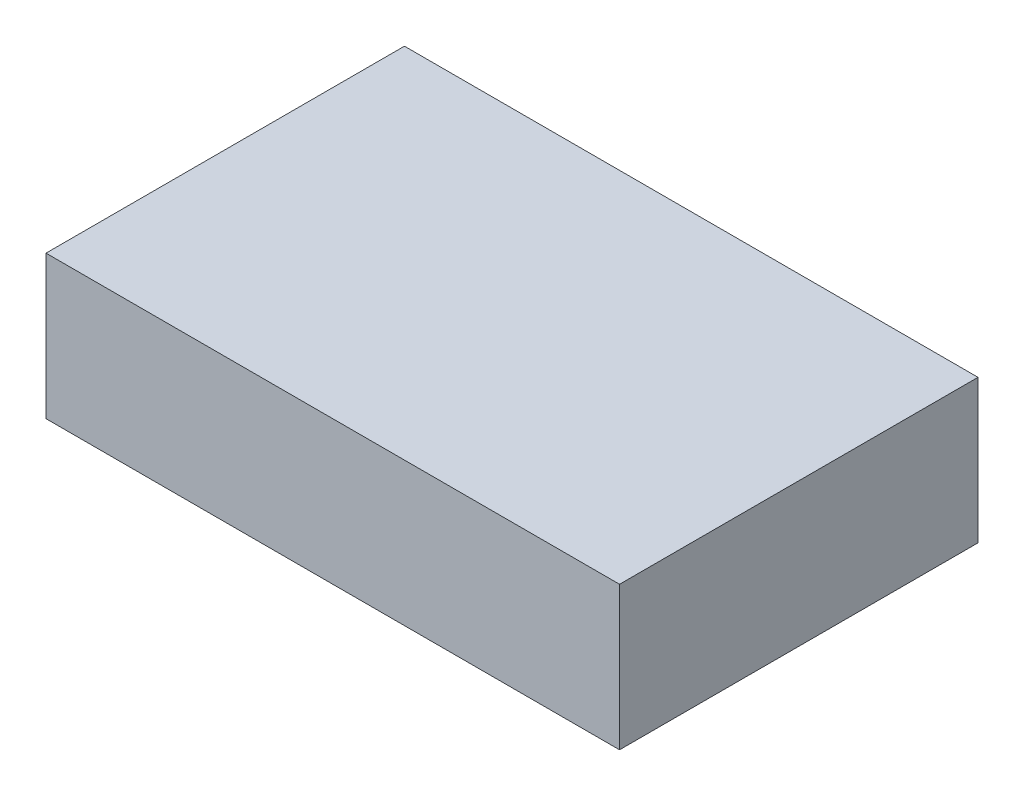
ISO-10303-21;
HEADER;
FILE_DESCRIPTION(('STEP AP214'),'2;1');
FILE_NAME('part.step','',(''),(''),'','','');
FILE_SCHEMA(('AUTOMOTIVE_DESIGN { 1 0 10303 214 1 1 1 1 }'));
ENDSEC;
DATA;
#1=APPLICATION_CONTEXT('core data for automotive mechanical design processes');
#2=APPLICATION_PROTOCOL_DEFINITION('international standard','automotive_design',2000,#1);
#3=PRODUCT_CONTEXT('',#1,'mechanical');
#4=PRODUCT('Part','Part','',(#3));
#5=PRODUCT_RELATED_PRODUCT_CATEGORY('part','',(#4));
#6=PRODUCT_DEFINITION_FORMATION('','',#4);
#7=PRODUCT_DEFINITION_CONTEXT('part definition',#1,'design');
#8=PRODUCT_DEFINITION('design','',#6,#7);
#9=PRODUCT_DEFINITION_SHAPE('','',#8);
#10=(LENGTH_UNIT() NAMED_UNIT(*) SI_UNIT(.MILLI.,.METRE.));
#11=(NAMED_UNIT(*) PLANE_ANGLE_UNIT() SI_UNIT($,.RADIAN.));
#12=(NAMED_UNIT(*) SI_UNIT($,.STERADIAN.) SOLID_ANGLE_UNIT());
#13=UNCERTAINTY_MEASURE_WITH_UNIT(LENGTH_MEASURE(1.E-05),#10,'distance_accuracy_value','');
#14=(GEOMETRIC_REPRESENTATION_CONTEXT(3) GLOBAL_UNCERTAINTY_ASSIGNED_CONTEXT((#13)) GLOBAL_UNIT_ASSIGNED_CONTEXT((#10,
#11,#12)) REPRESENTATION_CONTEXT('',''));
#15=CARTESIAN_POINT('',(0.,0.,0.));
#16=DIRECTION('',(0.,0.,1.));
#17=DIRECTION('',(1.,0.,0.));
#18=AXIS2_PLACEMENT_3D('',#15,#16,#17);
#19=CARTESIAN_POINT('',(0.,20.,0.));
#20=DIRECTION('',(1.,0.,0.));
#21=DIRECTION('',(0.,0.,-1.));
#22=AXIS2_PLACEMENT_3D('',#19,#20,#21);
#23=PLANE('',#22);
#24=DIRECTION('',(0.,0.,1.));
#25=VECTOR('',#24,1.);
#26=CARTESIAN_POINT('',(0.,0.,0.));
#27=LINE('',#26,#25);
#28=CARTESIAN_POINT('',(0.,0.,0.));
#29=VERTEX_POINT('',#28);
#30=CARTESIAN_POINT('',(0.,0.,50.));
#31=VERTEX_POINT('',#30);
#32=EDGE_CURVE('E104',#29,#31,#27,.T.);
#33=ORIENTED_EDGE('',*,*,#32,.T.);
#34=DIRECTION('',(0.,-1.,0.));
#35=VECTOR('',#34,1.);
#36=CARTESIAN_POINT('',(0.,20.,50.));
#37=LINE('',#36,#35);
#38=CARTESIAN_POINT('',(0.,20.,50.));
#39=VERTEX_POINT('',#38);
#40=EDGE_CURVE('E11',#39,#31,#37,.T.);
#41=ORIENTED_EDGE('',*,*,#40,.F.);
#42=DIRECTION('',(0.,0.,1.));
#43=VECTOR('',#42,1.);
#44=CARTESIAN_POINT('',(0.,20.,0.));
#45=LINE('',#44,#43);
#46=CARTESIAN_POINT('',(0.,20.,0.));
#47=VERTEX_POINT('',#46);
#48=EDGE_CURVE('E92',#47,#39,#45,.T.);
#49=ORIENTED_EDGE('',*,*,#48,.F.);
#50=DIRECTION('',(0.,-1.,0.));
#51=VECTOR('',#50,1.);
#52=CARTESIAN_POINT('',(0.,20.,0.));
#53=LINE('',#52,#51);
#54=EDGE_CURVE('E100',#47,#29,#53,.T.);
#55=ORIENTED_EDGE('',*,*,#54,.T.);
#56=EDGE_LOOP('',(#33,#41,#49,#55));
#57=FACE_BOUND('',#56,.T.);
#58=ADVANCED_FACE('F41',(#57),#23,.F.);
#59=CARTESIAN_POINT('',(0.,20.,50.));
#60=DIRECTION('',(0.,0.,-1.));
#61=DIRECTION('',(-1.,0.,0.));
#62=AXIS2_PLACEMENT_3D('',#59,#60,#61);
#63=PLANE('',#62);
#64=DIRECTION('',(1.,0.,0.));
#65=VECTOR('',#64,1.);
#66=CARTESIAN_POINT('',(0.,0.,50.));
#67=LINE('',#66,#65);
#68=CARTESIAN_POINT('',(80.,0.,50.));
#69=VERTEX_POINT('',#68);
#70=EDGE_CURVE('E96',#31,#69,#67,.T.);
#71=ORIENTED_EDGE('',*,*,#70,.T.);
#72=DIRECTION('',(0.,-1.,0.));
#73=VECTOR('',#72,1.);
#74=CARTESIAN_POINT('',(80.,20.,50.));
#75=LINE('',#74,#73);
#76=CARTESIAN_POINT('',(80.,20.,50.));
#77=VERTEX_POINT('',#76);
#78=EDGE_CURVE('E49',#77,#69,#75,.T.);
#79=ORIENTED_EDGE('',*,*,#78,.F.);
#80=DIRECTION('',(1.,0.,0.));
#81=VECTOR('',#80,1.);
#82=CARTESIAN_POINT('',(0.,20.,50.));
#83=LINE('',#82,#81);
#84=EDGE_CURVE('E87',#39,#77,#83,.T.);
#85=ORIENTED_EDGE('',*,*,#84,.F.);
#86=ORIENTED_EDGE('',*,*,#40,.T.);
#87=EDGE_LOOP('',(#71,#79,#85,#86));
#88=FACE_BOUND('',#87,.T.);
#89=ADVANCED_FACE('F95',(#88),#63,.F.);
#90=CARTESIAN_POINT('',(80.,20.,0.));
#91=DIRECTION('',(-1.,0.,0.));
#92=DIRECTION('',(0.,0.,1.));
#93=AXIS2_PLACEMENT_3D('',#90,#91,#92);
#94=PLANE('',#93);
#95=DIRECTION('',(0.,0.,-1.));
#96=VECTOR('',#95,1.);
#97=CARTESIAN_POINT('',(80.,0.,0.));
#98=LINE('',#97,#96);
#99=CARTESIAN_POINT('',(80.,0.,0.));
#100=VERTEX_POINT('',#99);
#101=EDGE_CURVE('E74',#69,#100,#98,.T.);
#102=ORIENTED_EDGE('',*,*,#101,.T.);
#103=DIRECTION('',(0.,-1.,0.));
#104=VECTOR('',#103,1.);
#105=CARTESIAN_POINT('',(80.,20.,0.));
#106=LINE('',#105,#104);
#107=CARTESIAN_POINT('',(80.,20.,0.));
#108=VERTEX_POINT('',#107);
#109=EDGE_CURVE('E97',#108,#100,#106,.T.);
#110=ORIENTED_EDGE('',*,*,#109,.F.);
#111=DIRECTION('',(0.,0.,-1.));
#112=VECTOR('',#111,1.);
#113=CARTESIAN_POINT('',(80.,20.,0.));
#114=LINE('',#113,#112);
#115=EDGE_CURVE('E90',#77,#108,#114,.T.);
#116=ORIENTED_EDGE('',*,*,#115,.F.);
#117=ORIENTED_EDGE('',*,*,#78,.T.);
#118=EDGE_LOOP('',(#102,#110,#116,#117));
#119=FACE_BOUND('',#118,.T.);
#120=ADVANCED_FACE('F98',(#119),#94,.F.);
#121=CARTESIAN_POINT('',(0.,20.,0.));
#122=DIRECTION('',(0.,0.,1.));
#123=DIRECTION('',(1.,0.,0.));
#124=AXIS2_PLACEMENT_3D('',#121,#122,#123);
#125=PLANE('',#124);
#126=DIRECTION('',(-1.,0.,0.));
#127=VECTOR('',#126,1.);
#128=CARTESIAN_POINT('',(0.,0.,0.));
#129=LINE('',#128,#127);
#130=EDGE_CURVE('E80',#100,#29,#129,.T.);
#131=ORIENTED_EDGE('',*,*,#130,.T.);
#132=ORIENTED_EDGE('',*,*,#54,.F.);
#133=DIRECTION('',(-1.,0.,0.));
#134=VECTOR('',#133,1.);
#135=CARTESIAN_POINT('',(0.,20.,0.));
#136=LINE('',#135,#134);
#137=EDGE_CURVE('E57',#108,#47,#136,.T.);
#138=ORIENTED_EDGE('',*,*,#137,.F.);
#139=ORIENTED_EDGE('',*,*,#109,.T.);
#140=EDGE_LOOP('',(#131,#132,#138,#139));
#141=FACE_BOUND('',#140,.T.);
#142=ADVANCED_FACE('F111',(#141),#125,.F.);
#143=CARTESIAN_POINT('',(0.,20.,0.));
#144=DIRECTION('',(0.,1.,0.));
#145=DIRECTION('',(0.,0.,1.));
#146=AXIS2_PLACEMENT_3D('',#143,#144,#145);
#147=PLANE('',#146);
#148=ORIENTED_EDGE('',*,*,#48,.T.);
#149=ORIENTED_EDGE('',*,*,#84,.T.);
#150=ORIENTED_EDGE('',*,*,#115,.T.);
#151=ORIENTED_EDGE('',*,*,#137,.T.);
#152=EDGE_LOOP('',(#148,#149,#150,#151));
#153=FACE_BOUND('',#152,.T.);
#154=ADVANCED_FACE('F88',(#153),#147,.T.);
#155=CARTESIAN_POINT('',(0.,0.,0.));
#156=DIRECTION('',(0.,1.,0.));
#157=DIRECTION('',(0.,0.,1.));
#158=AXIS2_PLACEMENT_3D('',#155,#156,#157);
#159=PLANE('',#158);
#160=ORIENTED_EDGE('',*,*,#32,.F.);
#161=ORIENTED_EDGE('',*,*,#130,.F.);
#162=ORIENTED_EDGE('',*,*,#101,.F.);
#163=ORIENTED_EDGE('',*,*,#70,.F.);
#164=EDGE_LOOP('',(#160,#161,#162,#163));
#165=FACE_BOUND('',#164,.T.);
#166=ADVANCED_FACE('F114',(#165),#159,.F.);
#167=CLOSED_SHELL('',(#58,#89,#120,#142,#154,#166));
#168=MANIFOLD_SOLID_BREP('B2',#167);
#169=ADVANCED_BREP_SHAPE_REPRESENTATION('',(#18,#168),#14);
#170=SHAPE_DEFINITION_REPRESENTATION(#9,#169);
ENDSEC;
END-ISO-10303-21;
